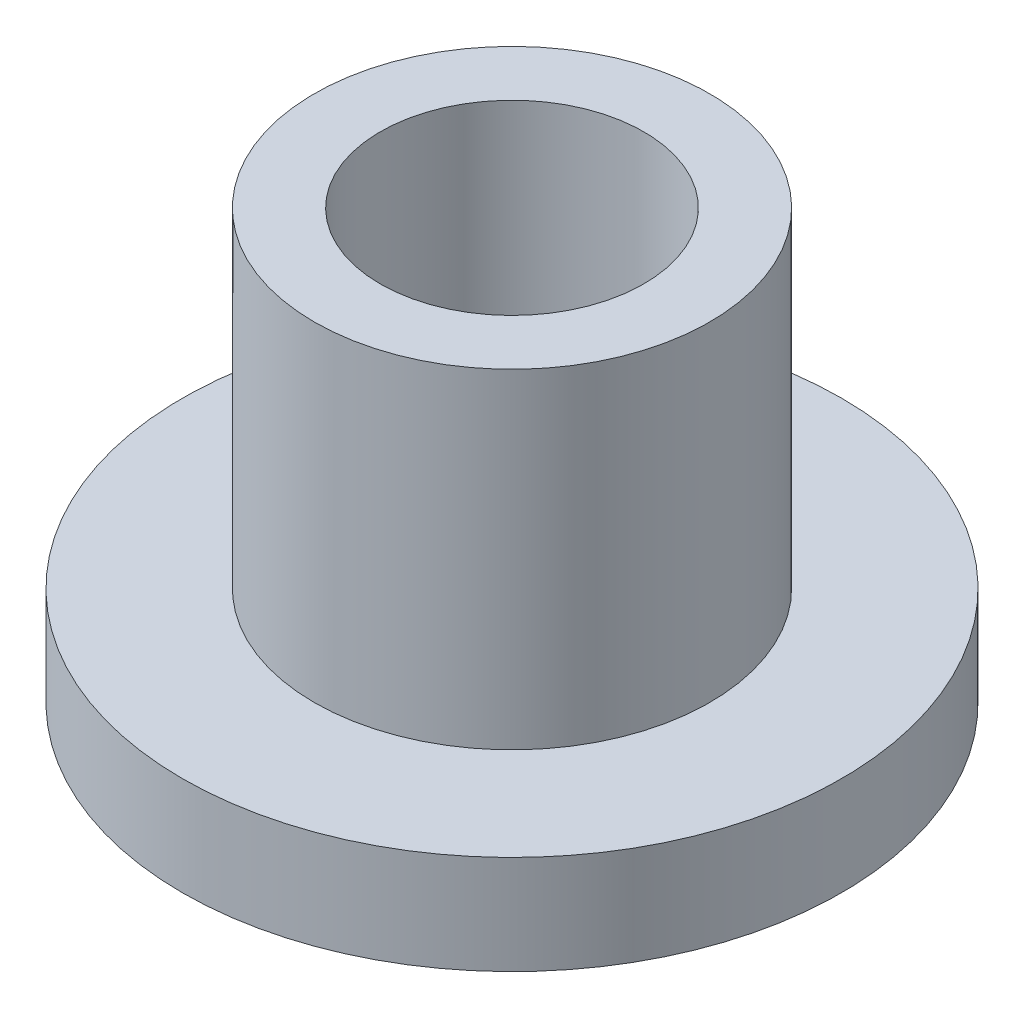
ISO-10303-21;
HEADER;
FILE_DESCRIPTION(('STEP AP214'),'2;1');
FILE_NAME('part.step','',(''),(''),'','','');
FILE_SCHEMA(('AUTOMOTIVE_DESIGN { 1 0 10303 214 1 1 1 1 }'));
ENDSEC;
DATA;
#1=APPLICATION_CONTEXT('core data for automotive mechanical design processes');
#2=APPLICATION_PROTOCOL_DEFINITION('international standard','automotive_design',2000,#1);
#3=PRODUCT_CONTEXT('',#1,'mechanical');
#4=PRODUCT('Part','Part','',(#3));
#5=PRODUCT_RELATED_PRODUCT_CATEGORY('part','',(#4));
#6=PRODUCT_DEFINITION_FORMATION('','',#4);
#7=PRODUCT_DEFINITION_CONTEXT('part definition',#1,'design');
#8=PRODUCT_DEFINITION('design','',#6,#7);
#9=PRODUCT_DEFINITION_SHAPE('','',#8);
#10=(LENGTH_UNIT() NAMED_UNIT(*) SI_UNIT(.MILLI.,.METRE.));
#11=(NAMED_UNIT(*) PLANE_ANGLE_UNIT() SI_UNIT($,.RADIAN.));
#12=(NAMED_UNIT(*) SI_UNIT($,.STERADIAN.) SOLID_ANGLE_UNIT());
#13=UNCERTAINTY_MEASURE_WITH_UNIT(LENGTH_MEASURE(1.E-05),#10,'distance_accuracy_value','');
#14=(GEOMETRIC_REPRESENTATION_CONTEXT(3) GLOBAL_UNCERTAINTY_ASSIGNED_CONTEXT((#13)) GLOBAL_UNIT_ASSIGNED_CONTEXT((#10,
#11,#12)) REPRESENTATION_CONTEXT('',''));
#15=CARTESIAN_POINT('',(0.,0.,0.));
#16=DIRECTION('',(0.,0.,1.));
#17=DIRECTION('',(1.,0.,0.));
#18=AXIS2_PLACEMENT_3D('',#15,#16,#17);
#19=CARTESIAN_POINT('',(0.,6.,0.));
#20=DIRECTION('',(0.,1.,0.));
#21=DIRECTION('',(0.,0.,1.));
#22=AXIS2_PLACEMENT_3D('',#19,#20,#21);
#23=PLANE('',#22);
#24=CARTESIAN_POINT('',(0.,6.,0.));
#25=DIRECTION('',(0.,1.,0.));
#26=DIRECTION('',(0.,0.,1.));
#27=AXIS2_PLACEMENT_3D('',#24,#25,#26);
#28=CIRCLE('',#27,20.);
#29=CARTESIAN_POINT('',(0.,6.,20.));
#30=VERTEX_POINT('',#29);
#31=EDGE_CURVE('E10',#30,#30,#28,.T.);
#32=ORIENTED_EDGE('',*,*,#31,.T.);
#33=EDGE_LOOP('',(#32));
#34=FACE_BOUND('',#33,.T.);
#35=CARTESIAN_POINT('',(0.,6.,0.));
#36=DIRECTION('',(0.,1.,0.));
#37=DIRECTION('',(0.,0.,1.));
#38=AXIS2_PLACEMENT_3D('',#35,#36,#37);
#39=CIRCLE('',#38,12.);
#40=CARTESIAN_POINT('',(0.,6.,12.));
#41=VERTEX_POINT('',#40);
#42=EDGE_CURVE('E42',#41,#41,#39,.T.);
#43=ORIENTED_EDGE('',*,*,#42,.F.);
#44=EDGE_LOOP('',(#43));
#45=FACE_BOUND('',#44,.T.);
#46=ADVANCED_FACE('F29',(#34,#45),#23,.T.);
#47=CARTESIAN_POINT('',(0.,6.,0.));
#48=DIRECTION('',(0.,-1.,0.));
#49=DIRECTION('',(0.,0.,-1.));
#50=AXIS2_PLACEMENT_3D('',#47,#48,#49);
#51=CYLINDRICAL_SURFACE('',#50,20.);
#52=ORIENTED_EDGE('',*,*,#31,.F.);
#53=EDGE_LOOP('',(#52));
#54=FACE_BOUND('',#53,.T.);
#55=CARTESIAN_POINT('',(0.,0.,0.));
#56=DIRECTION('',(0.,1.,0.));
#57=DIRECTION('',(0.,0.,1.));
#58=AXIS2_PLACEMENT_3D('',#55,#56,#57);
#59=CIRCLE('',#58,20.);
#60=CARTESIAN_POINT('',(0.,0.,20.));
#61=VERTEX_POINT('',#60);
#62=EDGE_CURVE('E33',#61,#61,#59,.T.);
#63=ORIENTED_EDGE('',*,*,#62,.T.);
#64=EDGE_LOOP('',(#63));
#65=FACE_BOUND('',#64,.T.);
#66=ADVANCED_FACE('F31',(#54,#65),#51,.T.);
#67=CARTESIAN_POINT('',(0.,0.,0.));
#68=DIRECTION('',(0.,1.,0.));
#69=DIRECTION('',(0.,0.,1.));
#70=AXIS2_PLACEMENT_3D('',#67,#68,#69);
#71=PLANE('',#70);
#72=ORIENTED_EDGE('',*,*,#62,.F.);
#73=EDGE_LOOP('',(#72));
#74=FACE_BOUND('',#73,.T.);
#75=ADVANCED_FACE('F71',(#74),#71,.F.);
#76=CARTESIAN_POINT('',(0.,26.,0.));
#77=DIRECTION('',(0.,-1.,0.));
#78=DIRECTION('',(0.,0.,-1.));
#79=AXIS2_PLACEMENT_3D('',#76,#77,#78);
#80=CYLINDRICAL_SURFACE('',#79,12.);
#81=CARTESIAN_POINT('',(0.,26.,0.));
#82=DIRECTION('',(0.,1.,0.));
#83=DIRECTION('',(0.,0.,1.));
#84=AXIS2_PLACEMENT_3D('',#81,#82,#83);
#85=CIRCLE('',#84,12.);
#86=CARTESIAN_POINT('',(0.,26.,12.));
#87=VERTEX_POINT('',#86);
#88=EDGE_CURVE('E40',#87,#87,#85,.T.);
#89=ORIENTED_EDGE('',*,*,#88,.F.);
#90=EDGE_LOOP('',(#89));
#91=FACE_BOUND('',#90,.T.);
#92=ORIENTED_EDGE('',*,*,#42,.T.);
#93=EDGE_LOOP('',(#92));
#94=FACE_BOUND('',#93,.T.);
#95=ADVANCED_FACE('F65',(#91,#94),#80,.T.);
#96=CARTESIAN_POINT('',(0.,26.,0.));
#97=DIRECTION('',(0.,1.,0.));
#98=DIRECTION('',(0.,0.,1.));
#99=AXIS2_PLACEMENT_3D('',#96,#97,#98);
#100=PLANE('',#99);
#101=CARTESIAN_POINT('',(0.,26.,0.));
#102=DIRECTION('',(0.,1.,0.));
#103=DIRECTION('',(0.,0.,1.));
#104=AXIS2_PLACEMENT_3D('',#101,#102,#103);
#105=CIRCLE('',#104,8.);
#106=CARTESIAN_POINT('',(0.,26.,8.));
#107=VERTEX_POINT('',#106);
#108=EDGE_CURVE('E48',#107,#107,#105,.T.);
#109=ORIENTED_EDGE('',*,*,#108,.F.);
#110=EDGE_LOOP('',(#109));
#111=FACE_BOUND('',#110,.T.);
#112=ORIENTED_EDGE('',*,*,#88,.T.);
#113=EDGE_LOOP('',(#112));
#114=FACE_BOUND('',#113,.T.);
#115=ADVANCED_FACE('F59',(#111,#114),#100,.T.);
#116=CARTESIAN_POINT('',(0.,1.,0.));
#117=DIRECTION('',(0.,1.,0.));
#118=DIRECTION('',(0.,0.,1.));
#119=AXIS2_PLACEMENT_3D('',#116,#117,#118);
#120=CYLINDRICAL_SURFACE('',#119,8.);
#121=CARTESIAN_POINT('',(0.,1.,0.));
#122=DIRECTION('',(0.,1.,0.));
#123=DIRECTION('',(0.,0.,1.));
#124=AXIS2_PLACEMENT_3D('',#121,#122,#123);
#125=CIRCLE('',#124,8.);
#126=CARTESIAN_POINT('',(0.,1.,8.));
#127=VERTEX_POINT('',#126);
#128=EDGE_CURVE('E45',#127,#127,#125,.T.);
#129=ORIENTED_EDGE('',*,*,#128,.F.);
#130=EDGE_LOOP('',(#129));
#131=FACE_BOUND('',#130,.T.);
#132=ORIENTED_EDGE('',*,*,#108,.T.);
#133=EDGE_LOOP('',(#132));
#134=FACE_BOUND('',#133,.T.);
#135=ADVANCED_FACE('F56',(#131,#134),#120,.F.);
#136=CARTESIAN_POINT('',(0.,1.,0.));
#137=DIRECTION('',(0.,1.,0.));
#138=DIRECTION('',(0.,0.,1.));
#139=AXIS2_PLACEMENT_3D('',#136,#137,#138);
#140=PLANE('',#139);
#141=ORIENTED_EDGE('',*,*,#128,.T.);
#142=EDGE_LOOP('',(#141));
#143=FACE_BOUND('',#142,.T.);
#144=ADVANCED_FACE('F54',(#143),#140,.T.);
#145=CLOSED_SHELL('',(#46,#66,#75,#95,#115,#135,#144));
#146=MANIFOLD_SOLID_BREP('B2',#145);
#147=ADVANCED_BREP_SHAPE_REPRESENTATION('',(#18,#146),#14);
#148=SHAPE_DEFINITION_REPRESENTATION(#9,#147);
ENDSEC;
END-ISO-10303-21;
